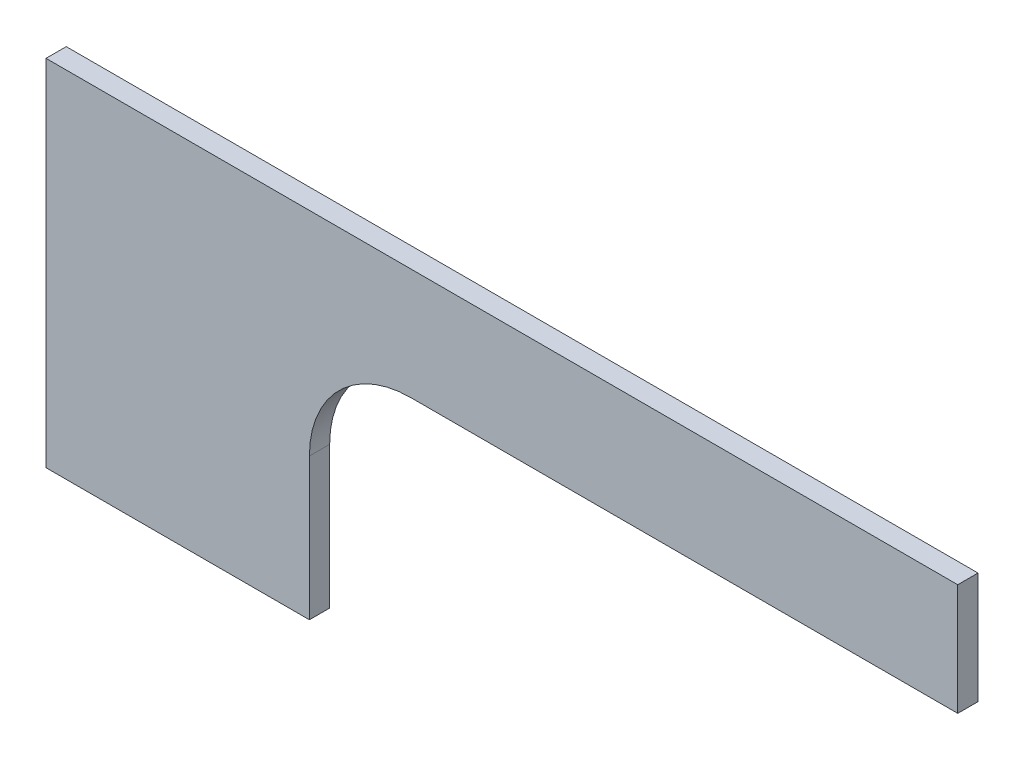
ISO-10303-21;
HEADER;
FILE_DESCRIPTION(('STEP AP214'),'2;1');
FILE_NAME('part.step','',(''),(''),'','','');
FILE_SCHEMA(('AUTOMOTIVE_DESIGN { 1 0 10303 214 1 1 1 1 }'));
ENDSEC;
DATA;
#1=APPLICATION_CONTEXT('core data for automotive mechanical design processes');
#2=APPLICATION_PROTOCOL_DEFINITION('international standard','automotive_design',2000,#1);
#3=PRODUCT_CONTEXT('',#1,'mechanical');
#4=PRODUCT('Part','Part','',(#3));
#5=PRODUCT_RELATED_PRODUCT_CATEGORY('part','',(#4));
#6=PRODUCT_DEFINITION_FORMATION('','',#4);
#7=PRODUCT_DEFINITION_CONTEXT('part definition',#1,'design');
#8=PRODUCT_DEFINITION('design','',#6,#7);
#9=PRODUCT_DEFINITION_SHAPE('','',#8);
#10=(LENGTH_UNIT() NAMED_UNIT(*) SI_UNIT(.MILLI.,.METRE.));
#11=(NAMED_UNIT(*) PLANE_ANGLE_UNIT() SI_UNIT($,.RADIAN.));
#12=(NAMED_UNIT(*) SI_UNIT($,.STERADIAN.) SOLID_ANGLE_UNIT());
#13=UNCERTAINTY_MEASURE_WITH_UNIT(LENGTH_MEASURE(1.E-05),#10,'distance_accuracy_value','');
#14=(GEOMETRIC_REPRESENTATION_CONTEXT(3) GLOBAL_UNCERTAINTY_ASSIGNED_CONTEXT((#13)) GLOBAL_UNIT_ASSIGNED_CONTEXT((#10,
#11,#12)) REPRESENTATION_CONTEXT('',''));
#15=CARTESIAN_POINT('',(0.,0.,0.));
#16=DIRECTION('',(0.,0.,1.));
#17=DIRECTION('',(1.,0.,0.));
#18=AXIS2_PLACEMENT_3D('',#15,#16,#17);
#19=CARTESIAN_POINT('',(45.7911367201859,6.80766428007229,2.));
#20=DIRECTION('',(-1.,0.,0.));
#21=DIRECTION('',(0.,0.,1.));
#22=AXIS2_PLACEMENT_3D('',#19,#20,#21);
#23=PLANE('',#22);
#24=DIRECTION('',(0.,1.,0.));
#25=VECTOR('',#24,1.);
#26=CARTESIAN_POINT('',(45.7911367201859,6.80766428007229,0.));
#27=LINE('',#26,#25);
#28=CARTESIAN_POINT('',(45.7911367201859,6.80766428007229,0.));
#29=VERTEX_POINT('',#28);
#30=CARTESIAN_POINT('',(45.7911367201859,17.8076642800723,0.));
#31=VERTEX_POINT('',#30);
#32=EDGE_CURVE('E116',#29,#31,#27,.T.);
#33=ORIENTED_EDGE('',*,*,#32,.T.);
#34=DIRECTION('',(0.,0.,-1.));
#35=VECTOR('',#34,1.);
#36=CARTESIAN_POINT('',(45.7911367201859,17.8076642800723,2.));
#37=LINE('',#36,#35);
#38=CARTESIAN_POINT('',(45.7911367201859,17.8076642800723,2.));
#39=VERTEX_POINT('',#38);
#40=EDGE_CURVE('E97',#39,#31,#37,.T.);
#41=ORIENTED_EDGE('',*,*,#40,.F.);
#42=DIRECTION('',(0.,1.,0.));
#43=VECTOR('',#42,1.);
#44=CARTESIAN_POINT('',(45.7911367201859,6.80766428007229,2.));
#45=LINE('',#44,#43);
#46=CARTESIAN_POINT('',(45.7911367201859,6.80766428007229,2.));
#47=VERTEX_POINT('',#46);
#48=EDGE_CURVE('E104',#47,#39,#45,.T.);
#49=ORIENTED_EDGE('',*,*,#48,.F.);
#50=DIRECTION('',(0.,0.,-1.));
#51=VECTOR('',#50,1.);
#52=CARTESIAN_POINT('',(45.7911367201859,6.80766428007229,2.));
#53=LINE('',#52,#51);
#54=EDGE_CURVE('E130',#47,#29,#53,.T.);
#55=ORIENTED_EDGE('',*,*,#54,.T.);
#56=EDGE_LOOP('',(#33,#41,#49,#55));
#57=FACE_BOUND('',#56,.T.);
#58=ADVANCED_FACE('F34',(#57),#23,.F.);
#59=CARTESIAN_POINT('',(-44.2088632798141,17.8076642800723,2.));
#60=DIRECTION('',(0.,-1.,0.));
#61=DIRECTION('',(0.,0.,-1.));
#62=AXIS2_PLACEMENT_3D('',#59,#60,#61);
#63=PLANE('',#62);
#64=DIRECTION('',(-1.,0.,0.));
#65=VECTOR('',#64,1.);
#66=CARTESIAN_POINT('',(-44.2088632798141,17.8076642800723,0.));
#67=LINE('',#66,#65);
#68=CARTESIAN_POINT('',(-44.2088632798141,17.8076642800723,0.));
#69=VERTEX_POINT('',#68);
#70=EDGE_CURVE('E139',#31,#69,#67,.T.);
#71=ORIENTED_EDGE('',*,*,#70,.T.);
#72=DIRECTION('',(0.,0.,-1.));
#73=VECTOR('',#72,1.);
#74=CARTESIAN_POINT('',(-44.2088632798141,17.8076642800723,2.));
#75=LINE('',#74,#73);
#76=CARTESIAN_POINT('',(-44.2088632798141,17.8076642800723,2.));
#77=VERTEX_POINT('',#76);
#78=EDGE_CURVE('E100',#77,#69,#75,.T.);
#79=ORIENTED_EDGE('',*,*,#78,.F.);
#80=DIRECTION('',(-1.,0.,0.));
#81=VECTOR('',#80,1.);
#82=CARTESIAN_POINT('',(-44.2088632798141,17.8076642800723,2.));
#83=LINE('',#82,#81);
#84=EDGE_CURVE('E93',#39,#77,#83,.T.);
#85=ORIENTED_EDGE('',*,*,#84,.F.);
#86=ORIENTED_EDGE('',*,*,#40,.T.);
#87=EDGE_LOOP('',(#71,#79,#85,#86));
#88=FACE_BOUND('',#87,.T.);
#89=ADVANCED_FACE('F95',(#88),#63,.F.);
#90=CARTESIAN_POINT('',(-44.2088632798141,-17.1923357199277,2.));
#91=DIRECTION('',(1.,0.,0.));
#92=DIRECTION('',(0.,0.,-1.));
#93=AXIS2_PLACEMENT_3D('',#90,#91,#92);
#94=PLANE('',#93);
#95=DIRECTION('',(0.,-1.,0.));
#96=VECTOR('',#95,1.);
#97=CARTESIAN_POINT('',(-44.2088632798141,-17.1923357199277,0.));
#98=LINE('',#97,#96);
#99=CARTESIAN_POINT('',(-44.2088632798141,-17.1923357199277,0.));
#100=VERTEX_POINT('',#99);
#101=EDGE_CURVE('E137',#69,#100,#98,.T.);
#102=ORIENTED_EDGE('',*,*,#101,.T.);
#103=DIRECTION('',(0.,0.,-1.));
#104=VECTOR('',#103,1.);
#105=CARTESIAN_POINT('',(-44.2088632798141,-17.1923357199277,2.));
#106=LINE('',#105,#104);
#107=CARTESIAN_POINT('',(-44.2088632798141,-17.1923357199277,2.));
#108=VERTEX_POINT('',#107);
#109=EDGE_CURVE('E121',#108,#100,#106,.T.);
#110=ORIENTED_EDGE('',*,*,#109,.F.);
#111=DIRECTION('',(0.,-1.,0.));
#112=VECTOR('',#111,1.);
#113=CARTESIAN_POINT('',(-44.2088632798141,-17.1923357199277,2.));
#114=LINE('',#113,#112);
#115=EDGE_CURVE('E103',#77,#108,#114,.T.);
#116=ORIENTED_EDGE('',*,*,#115,.F.);
#117=ORIENTED_EDGE('',*,*,#78,.T.);
#118=EDGE_LOOP('',(#102,#110,#116,#117));
#119=FACE_BOUND('',#118,.T.);
#120=ADVANCED_FACE('F151',(#119),#94,.F.);
#121=CARTESIAN_POINT('',(-44.2088632798141,-17.1923357199277,2.));
#122=DIRECTION('',(0.,1.,0.));
#123=DIRECTION('',(0.,0.,1.));
#124=AXIS2_PLACEMENT_3D('',#121,#122,#123);
#125=PLANE('',#124);
#126=DIRECTION('',(1.,0.,0.));
#127=VECTOR('',#126,1.);
#128=CARTESIAN_POINT('',(-44.2088632798141,-17.1923357199277,0.));
#129=LINE('',#128,#127);
#130=CARTESIAN_POINT('',(-18.2088632798141,-17.1923357199277,0.));
#131=VERTEX_POINT('',#130);
#132=EDGE_CURVE('E135',#100,#131,#129,.T.);
#133=ORIENTED_EDGE('',*,*,#132,.T.);
#134=DIRECTION('',(0.,0.,-1.));
#135=VECTOR('',#134,1.);
#136=CARTESIAN_POINT('',(-18.2088632798141,-17.1923357199277,2.));
#137=LINE('',#136,#135);
#138=CARTESIAN_POINT('',(-18.2088632798141,-17.1923357199277,2.));
#139=VERTEX_POINT('',#138);
#140=EDGE_CURVE('E127',#139,#131,#137,.T.);
#141=ORIENTED_EDGE('',*,*,#140,.F.);
#142=DIRECTION('',(1.,0.,0.));
#143=VECTOR('',#142,1.);
#144=CARTESIAN_POINT('',(-44.2088632798141,-17.1923357199277,2.));
#145=LINE('',#144,#143);
#146=EDGE_CURVE('E145',#108,#139,#145,.T.);
#147=ORIENTED_EDGE('',*,*,#146,.F.);
#148=ORIENTED_EDGE('',*,*,#109,.T.);
#149=EDGE_LOOP('',(#133,#141,#147,#148));
#150=FACE_BOUND('',#149,.T.);
#151=ADVANCED_FACE('F155',(#150),#125,.F.);
#152=CARTESIAN_POINT('',(-18.2088632798141,-17.1923357199277,2.));
#153=DIRECTION('',(-1.,0.,0.));
#154=DIRECTION('',(0.,0.,1.));
#155=AXIS2_PLACEMENT_3D('',#152,#153,#154);
#156=PLANE('',#155);
#157=DIRECTION('',(0.,1.,0.));
#158=VECTOR('',#157,1.);
#159=CARTESIAN_POINT('',(-18.2088632798141,-17.1923357199277,0.));
#160=LINE('',#159,#158);
#161=CARTESIAN_POINT('',(-18.2088632798141,-3.19233571992771,0.));
#162=VERTEX_POINT('',#161);
#163=EDGE_CURVE('E133',#131,#162,#160,.T.);
#164=ORIENTED_EDGE('',*,*,#163,.T.);
#165=DIRECTION('',(0.,0.,-1.));
#166=VECTOR('',#165,1.);
#167=CARTESIAN_POINT('',(-18.2088632798141,-3.19233571992771,2.));
#168=LINE('',#167,#166);
#169=CARTESIAN_POINT('',(-18.2088632798141,-3.19233571992771,2.));
#170=VERTEX_POINT('',#169);
#171=EDGE_CURVE('E49',#162,#170,#168,.F.);
#172=ORIENTED_EDGE('',*,*,#171,.T.);
#173=DIRECTION('',(0.,1.,0.));
#174=VECTOR('',#173,1.);
#175=CARTESIAN_POINT('',(-18.2088632798141,-17.1923357199277,2.));
#176=LINE('',#175,#174);
#177=EDGE_CURVE('E143',#139,#170,#176,.T.);
#178=ORIENTED_EDGE('',*,*,#177,.F.);
#179=ORIENTED_EDGE('',*,*,#140,.T.);
#180=EDGE_LOOP('',(#164,#172,#178,#179));
#181=FACE_BOUND('',#180,.T.);
#182=ADVANCED_FACE('F156',(#181),#156,.F.);
#183=CARTESIAN_POINT('',(-18.2088632798141,6.80766428007229,2.));
#184=DIRECTION('',(0.,1.,0.));
#185=DIRECTION('',(0.,0.,1.));
#186=AXIS2_PLACEMENT_3D('',#183,#184,#185);
#187=PLANE('',#186);
#188=DIRECTION('',(1.,0.,0.));
#189=VECTOR('',#188,1.);
#190=CARTESIAN_POINT('',(-18.2088632798141,6.80766428007229,2.));
#191=LINE('',#190,#189);
#192=CARTESIAN_POINT('',(-8.20886327981412,6.80766428007229,2.));
#193=VERTEX_POINT('',#192);
#194=EDGE_CURVE('E109',#193,#47,#191,.T.);
#195=ORIENTED_EDGE('',*,*,#194,.F.);
#196=DIRECTION('',(0.,0.,-1.));
#197=VECTOR('',#196,1.);
#198=CARTESIAN_POINT('',(-8.20886327981412,6.80766428007229,0.));
#199=LINE('',#198,#197);
#200=CARTESIAN_POINT('',(-8.20886327981412,6.80766428007229,0.));
#201=VERTEX_POINT('',#200);
#202=EDGE_CURVE('E117',#193,#201,#199,.T.);
#203=ORIENTED_EDGE('',*,*,#202,.T.);
#204=DIRECTION('',(1.,0.,0.));
#205=VECTOR('',#204,1.);
#206=CARTESIAN_POINT('',(-18.2088632798141,6.80766428007229,0.));
#207=LINE('',#206,#205);
#208=EDGE_CURVE('E113',#201,#29,#207,.T.);
#209=ORIENTED_EDGE('',*,*,#208,.T.);
#210=ORIENTED_EDGE('',*,*,#54,.F.);
#211=EDGE_LOOP('',(#195,#203,#209,#210));
#212=FACE_BOUND('',#211,.T.);
#213=ADVANCED_FACE('F161',(#212),#187,.F.);
#214=CARTESIAN_POINT('',(0.,0.,2.));
#215=DIRECTION('',(0.,0.,-1.));
#216=DIRECTION('',(-1.,0.,0.));
#217=AXIS2_PLACEMENT_3D('',#214,#215,#216);
#218=PLANE('',#217);
#219=ORIENTED_EDGE('',*,*,#48,.T.);
#220=ORIENTED_EDGE('',*,*,#84,.T.);
#221=ORIENTED_EDGE('',*,*,#115,.T.);
#222=ORIENTED_EDGE('',*,*,#146,.T.);
#223=ORIENTED_EDGE('',*,*,#177,.T.);
#224=CARTESIAN_POINT('',(-8.20886327981412,-3.19233571992771,2.));
#225=DIRECTION('',(0.,0.,-1.));
#226=DIRECTION('',(-1.,0.,0.));
#227=AXIS2_PLACEMENT_3D('',#224,#225,#226);
#228=CIRCLE('',#227,10.);
#229=EDGE_CURVE('E11',#170,#193,#228,.T.);
#230=ORIENTED_EDGE('',*,*,#229,.T.);
#231=ORIENTED_EDGE('',*,*,#194,.T.);
#232=EDGE_LOOP('',(#219,#220,#221,#222,#223,#230,#231));
#233=FACE_BOUND('',#232,.T.);
#234=ADVANCED_FACE('F107',(#233),#218,.F.);
#235=CARTESIAN_POINT('',(0.,0.,0.));
#236=DIRECTION('',(0.,0.,-1.));
#237=DIRECTION('',(-1.,0.,0.));
#238=AXIS2_PLACEMENT_3D('',#235,#236,#237);
#239=PLANE('',#238);
#240=ORIENTED_EDGE('',*,*,#32,.F.);
#241=ORIENTED_EDGE('',*,*,#208,.F.);
#242=CARTESIAN_POINT('',(-8.20886327981412,-3.19233571992771,0.));
#243=DIRECTION('',(0.,0.,-1.));
#244=DIRECTION('',(-1.,0.,0.));
#245=AXIS2_PLACEMENT_3D('',#242,#243,#244);
#246=CIRCLE('',#245,10.);
#247=EDGE_CURVE('E42',#201,#162,#246,.F.);
#248=ORIENTED_EDGE('',*,*,#247,.T.);
#249=ORIENTED_EDGE('',*,*,#163,.F.);
#250=ORIENTED_EDGE('',*,*,#132,.F.);
#251=ORIENTED_EDGE('',*,*,#101,.F.);
#252=ORIENTED_EDGE('',*,*,#70,.F.);
#253=EDGE_LOOP('',(#240,#241,#248,#249,#250,#251,#252));
#254=FACE_BOUND('',#253,.T.);
#255=ADVANCED_FACE('F162',(#254),#239,.T.);
#256=CARTESIAN_POINT('',(-8.20886327981412,-3.19233571992771,2.));
#257=DIRECTION('',(0.,0.,1.));
#258=DIRECTION('',(1.,0.,0.));
#259=AXIS2_PLACEMENT_3D('',#256,#257,#258);
#260=CYLINDRICAL_SURFACE('',#259,10.);
#261=ORIENTED_EDGE('',*,*,#229,.F.);
#262=ORIENTED_EDGE('',*,*,#171,.F.);
#263=ORIENTED_EDGE('',*,*,#247,.F.);
#264=ORIENTED_EDGE('',*,*,#202,.F.);
#265=EDGE_LOOP('',(#261,#262,#263,#264));
#266=FACE_BOUND('',#265,.T.);
#267=ADVANCED_FACE('F36',(#266),#260,.F.);
#268=CLOSED_SHELL('',(#58,#89,#120,#151,#182,#213,#234,#255,#267));
#269=MANIFOLD_SOLID_BREP('B2',#268);
#270=ADVANCED_BREP_SHAPE_REPRESENTATION('',(#18,#269),#14);
#271=SHAPE_DEFINITION_REPRESENTATION(#9,#270);
ENDSEC;
END-ISO-10303-21;
